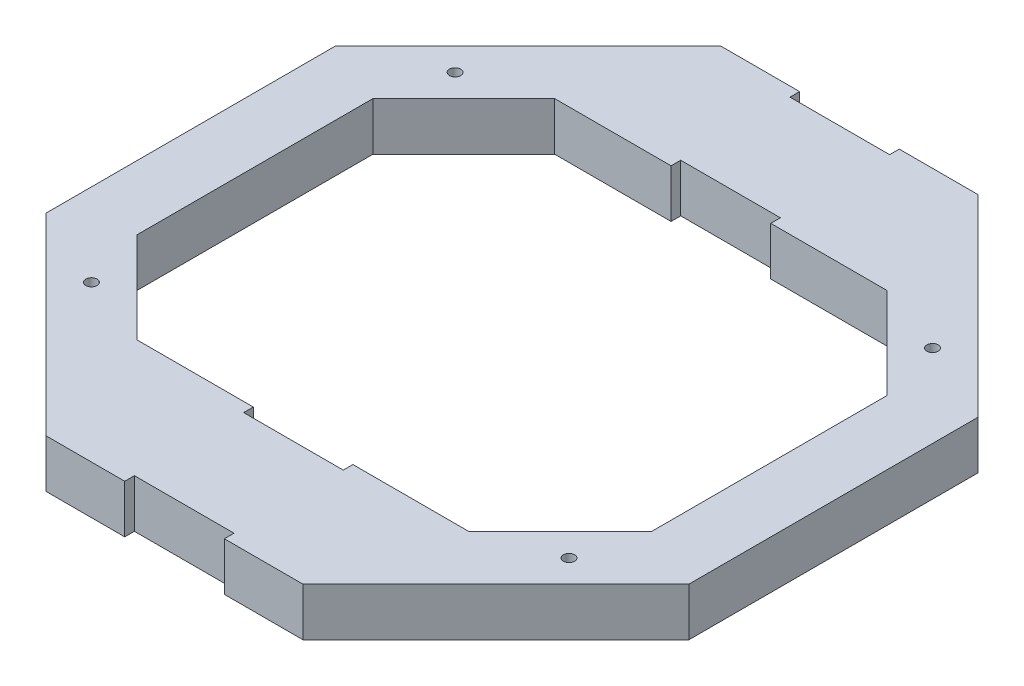
ISO-10303-21;
HEADER;
FILE_DESCRIPTION(('STEP AP214'),'2;1');
FILE_NAME('part.step','',(''),(''),'','','');
FILE_SCHEMA(('AUTOMOTIVE_DESIGN { 1 0 10303 214 1 1 1 1 }'));
ENDSEC;
DATA;
#1=APPLICATION_CONTEXT('core data for automotive mechanical design processes');
#2=APPLICATION_PROTOCOL_DEFINITION('international standard','automotive_design',2000,#1);
#3=PRODUCT_CONTEXT('',#1,'mechanical');
#4=PRODUCT('Part','Part','',(#3));
#5=PRODUCT_RELATED_PRODUCT_CATEGORY('part','',(#4));
#6=PRODUCT_DEFINITION_FORMATION('','',#4);
#7=PRODUCT_DEFINITION_CONTEXT('part definition',#1,'design');
#8=PRODUCT_DEFINITION('design','',#6,#7);
#9=PRODUCT_DEFINITION_SHAPE('','',#8);
#10=(LENGTH_UNIT() NAMED_UNIT(*) SI_UNIT(.MILLI.,.METRE.));
#11=(NAMED_UNIT(*) PLANE_ANGLE_UNIT() SI_UNIT($,.RADIAN.));
#12=(NAMED_UNIT(*) SI_UNIT($,.STERADIAN.) SOLID_ANGLE_UNIT());
#13=UNCERTAINTY_MEASURE_WITH_UNIT(LENGTH_MEASURE(1.E-05),#10,'distance_accuracy_value','');
#14=(GEOMETRIC_REPRESENTATION_CONTEXT(3) GLOBAL_UNCERTAINTY_ASSIGNED_CONTEXT((#13)) GLOBAL_UNIT_ASSIGNED_CONTEXT((#10,
#11,#12)) REPRESENTATION_CONTEXT('',''));
#15=CARTESIAN_POINT('',(0.,0.,0.));
#16=DIRECTION('',(0.,0.,1.));
#17=DIRECTION('',(1.,0.,0.));
#18=AXIS2_PLACEMENT_3D('',#15,#16,#17);
#19=CARTESIAN_POINT('',(-40.0000000000001,15.,105.));
#20=DIRECTION('',(0.,0.,-1.));
#21=DIRECTION('',(-1.,0.,0.));
#22=AXIS2_PLACEMENT_3D('',#19,#20,#21);
#23=PLANE('',#22);
#24=DIRECTION('',(1.,0.,0.));
#25=VECTOR('',#24,1.);
#26=CARTESIAN_POINT('',(-40.0000000000001,0.,105.));
#27=LINE('',#26,#25);
#28=CARTESIAN_POINT('',(-40.0000000000001,0.,105.));
#29=VERTEX_POINT('',#28);
#30=CARTESIAN_POINT('',(-15.5,0.,105.));
#31=VERTEX_POINT('',#30);
#32=EDGE_CURVE('E263',#29,#31,#27,.T.);
#33=ORIENTED_EDGE('',*,*,#32,.T.);
#34=DIRECTION('',(0.,1.,0.));
#35=VECTOR('',#34,1.);
#36=CARTESIAN_POINT('',(-15.5,0.,105.));
#37=LINE('',#36,#35);
#38=CARTESIAN_POINT('',(-15.5,15.,105.));
#39=VERTEX_POINT('',#38);
#40=EDGE_CURVE('E244',#31,#39,#37,.T.);
#41=ORIENTED_EDGE('',*,*,#40,.T.);
#42=DIRECTION('',(1.,0.,0.));
#43=VECTOR('',#42,1.);
#44=CARTESIAN_POINT('',(-40.0000000000001,15.,105.));
#45=LINE('',#44,#43);
#46=CARTESIAN_POINT('',(-40.0000000000001,15.,105.));
#47=VERTEX_POINT('',#46);
#48=EDGE_CURVE('E361',#47,#39,#45,.T.);
#49=ORIENTED_EDGE('',*,*,#48,.F.);
#50=DIRECTION('',(0.,-1.,0.));
#51=VECTOR('',#50,1.);
#52=CARTESIAN_POINT('',(-40.0000000000001,15.,105.));
#53=LINE('',#52,#51);
#54=EDGE_CURVE('E43',#47,#29,#53,.T.);
#55=ORIENTED_EDGE('',*,*,#54,.T.);
#56=EDGE_LOOP('',(#33,#41,#49,#55));
#57=FACE_BOUND('',#56,.T.);
#58=ADVANCED_FACE('F35',(#57),#23,.F.);
#59=CARTESIAN_POINT('',(-40.,15.,-105.));
#60=DIRECTION('',(0.,0.,1.));
#61=DIRECTION('',(1.,0.,0.));
#62=AXIS2_PLACEMENT_3D('',#59,#60,#61);
#63=PLANE('',#62);
#64=DIRECTION('',(-1.,0.,0.));
#65=VECTOR('',#64,1.);
#66=CARTESIAN_POINT('',(-40.,0.,-105.));
#67=LINE('',#66,#65);
#68=CARTESIAN_POINT('',(40.,0.,-105.));
#69=VERTEX_POINT('',#68);
#70=CARTESIAN_POINT('',(15.5,0.,-105.));
#71=VERTEX_POINT('',#70);
#72=EDGE_CURVE('E282',#69,#71,#67,.T.);
#73=ORIENTED_EDGE('',*,*,#72,.T.);
#74=DIRECTION('',(0.,1.,0.));
#75=VECTOR('',#74,1.);
#76=CARTESIAN_POINT('',(15.5,0.,-105.));
#77=LINE('',#76,#75);
#78=CARTESIAN_POINT('',(15.5,15.,-105.));
#79=VERTEX_POINT('',#78);
#80=EDGE_CURVE('E387',#71,#79,#77,.T.);
#81=ORIENTED_EDGE('',*,*,#80,.T.);
#82=DIRECTION('',(-1.,0.,0.));
#83=VECTOR('',#82,1.);
#84=CARTESIAN_POINT('',(-40.,15.,-105.));
#85=LINE('',#84,#83);
#86=CARTESIAN_POINT('',(40.,15.,-105.));
#87=VERTEX_POINT('',#86);
#88=EDGE_CURVE('E334',#87,#79,#85,.T.);
#89=ORIENTED_EDGE('',*,*,#88,.F.);
#90=DIRECTION('',(0.,-1.,0.));
#91=VECTOR('',#90,1.);
#92=CARTESIAN_POINT('',(40.,15.,-105.));
#93=LINE('',#92,#91);
#94=EDGE_CURVE('E295',#87,#69,#93,.T.);
#95=ORIENTED_EDGE('',*,*,#94,.T.);
#96=EDGE_LOOP('',(#73,#81,#89,#95));
#97=FACE_BOUND('',#96,.T.);
#98=ADVANCED_FACE('F605',(#97),#63,.F.);
#99=CARTESIAN_POINT('',(-51.7157287525382,15.,65.));
#100=DIRECTION('',(0.,0.,-1.));
#101=DIRECTION('',(-1.,0.,0.));
#102=AXIS2_PLACEMENT_3D('',#99,#100,#101);
#103=PLANE('',#102);
#104=DIRECTION('',(0.,1.,0.));
#105=VECTOR('',#104,1.);
#106=CARTESIAN_POINT('',(15.5,0.,65.));
#107=LINE('',#106,#105);
#108=CARTESIAN_POINT('',(15.5,0.,65.));
#109=VERTEX_POINT('',#108);
#110=CARTESIAN_POINT('',(15.5,15.,65.));
#111=VERTEX_POINT('',#110);
#112=EDGE_CURVE('E380',#109,#111,#107,.T.);
#113=ORIENTED_EDGE('',*,*,#112,.T.);
#114=DIRECTION('',(1.,0.,0.));
#115=VECTOR('',#114,1.);
#116=CARTESIAN_POINT('',(-51.7157287525382,15.,65.));
#117=LINE('',#116,#115);
#118=CARTESIAN_POINT('',(51.7157287525383,15.,65.));
#119=VERTEX_POINT('',#118);
#120=EDGE_CURVE('E473',#111,#119,#117,.T.);
#121=ORIENTED_EDGE('',*,*,#120,.T.);
#122=DIRECTION('',(0.,-1.,0.));
#123=VECTOR('',#122,1.);
#124=CARTESIAN_POINT('',(51.7157287525383,15.,65.));
#125=LINE('',#124,#123);
#126=CARTESIAN_POINT('',(51.7157287525383,0.,65.));
#127=VERTEX_POINT('',#126);
#128=EDGE_CURVE('E346',#119,#127,#125,.T.);
#129=ORIENTED_EDGE('',*,*,#128,.T.);
#130=DIRECTION('',(1.,0.,0.));
#131=VECTOR('',#130,1.);
#132=CARTESIAN_POINT('',(-51.7157287525382,0.,65.));
#133=LINE('',#132,#131);
#134=EDGE_CURVE('E495',#109,#127,#133,.T.);
#135=ORIENTED_EDGE('',*,*,#134,.F.);
#136=EDGE_LOOP('',(#113,#121,#129,#135));
#137=FACE_BOUND('',#136,.T.);
#138=ADVANCED_FACE('F542',(#137),#103,.T.);
#139=CARTESIAN_POINT('',(-51.7157287525382,15.,-65.));
#140=DIRECTION('',(0.,0.,1.));
#141=DIRECTION('',(1.,0.,0.));
#142=AXIS2_PLACEMENT_3D('',#139,#140,#141);
#143=PLANE('',#142);
#144=DIRECTION('',(0.,1.,0.));
#145=VECTOR('',#144,1.);
#146=CARTESIAN_POINT('',(-15.5,0.,-65.));
#147=LINE('',#146,#145);
#148=CARTESIAN_POINT('',(-15.5,0.,-65.));
#149=VERTEX_POINT('',#148);
#150=CARTESIAN_POINT('',(-15.5,15.,-65.));
#151=VERTEX_POINT('',#150);
#152=EDGE_CURVE('E425',#149,#151,#147,.T.);
#153=ORIENTED_EDGE('',*,*,#152,.T.);
#154=DIRECTION('',(-1.,0.,0.));
#155=VECTOR('',#154,1.);
#156=CARTESIAN_POINT('',(-51.7157287525382,15.,-65.));
#157=LINE('',#156,#155);
#158=CARTESIAN_POINT('',(-51.7157287525382,15.,-65.));
#159=VERTEX_POINT('',#158);
#160=EDGE_CURVE('E484',#151,#159,#157,.T.);
#161=ORIENTED_EDGE('',*,*,#160,.T.);
#162=DIRECTION('',(0.,-1.,0.));
#163=VECTOR('',#162,1.);
#164=CARTESIAN_POINT('',(-51.7157287525382,15.,-65.));
#165=LINE('',#164,#163);
#166=CARTESIAN_POINT('',(-51.7157287525382,0.,-65.));
#167=VERTEX_POINT('',#166);
#168=EDGE_CURVE('E521',#159,#167,#165,.T.);
#169=ORIENTED_EDGE('',*,*,#168,.T.);
#170=DIRECTION('',(-1.,0.,0.));
#171=VECTOR('',#170,1.);
#172=CARTESIAN_POINT('',(-51.7157287525382,0.,-65.));
#173=LINE('',#172,#171);
#174=EDGE_CURVE('E508',#149,#167,#173,.T.);
#175=ORIENTED_EDGE('',*,*,#174,.F.);
#176=EDGE_LOOP('',(#153,#161,#169,#175));
#177=FACE_BOUND('',#176,.T.);
#178=ADVANCED_FACE('F569',(#177),#143,.T.);
#179=CARTESIAN_POINT('',(0.,15.,0.));
#180=DIRECTION('',(0.,1.,0.));
#181=DIRECTION('',(0.,0.,1.));
#182=AXIS2_PLACEMENT_3D('',#179,#180,#181);
#183=PLANE('',#182);
#184=CARTESIAN_POINT('',(-74.2893218813453,15.,56.5685424949239));
#185=DIRECTION('',(0.,1.,0.));
#186=DIRECTION('',(0.,0.,1.));
#187=AXIS2_PLACEMENT_3D('',#184,#185,#186);
#188=CIRCLE('',#187,1.75000000000001);
#189=CARTESIAN_POINT('',(-74.2893218813453,15.,58.3185424949239));
#190=VERTEX_POINT('',#189);
#191=EDGE_CURVE('E467',#190,#190,#188,.T.);
#192=ORIENTED_EDGE('',*,*,#191,.F.);
#193=EDGE_LOOP('',(#192));
#194=FACE_BOUND('',#193,.T.);
#195=DIRECTION('',(0.,0.,1.));
#196=VECTOR('',#195,1.);
#197=CARTESIAN_POINT('',(-15.4999999999996,15.,0.));
#198=LINE('',#197,#196);
#199=CARTESIAN_POINT('',(-15.4999999999999,15.,102.));
#200=VERTEX_POINT('',#199);
#201=EDGE_CURVE('E251',#200,#39,#198,.T.);
#202=ORIENTED_EDGE('',*,*,#201,.F.);
#203=DIRECTION('',(-1.,0.,0.));
#204=VECTOR('',#203,1.);
#205=CARTESIAN_POINT('',(0.,15.,102.));
#206=LINE('',#205,#204);
#207=CARTESIAN_POINT('',(15.5,15.,102.));
#208=VERTEX_POINT('',#207);
#209=EDGE_CURVE('E465',#208,#200,#206,.T.);
#210=ORIENTED_EDGE('',*,*,#209,.F.);
#211=DIRECTION('',(0.,0.,-1.));
#212=VECTOR('',#211,1.);
#213=CARTESIAN_POINT('',(15.4999999999996,15.,0.));
#214=LINE('',#213,#212);
#215=CARTESIAN_POINT('',(15.5,15.,105.));
#216=VERTEX_POINT('',#215);
#217=EDGE_CURVE('E366',#216,#208,#214,.T.);
#218=ORIENTED_EDGE('',*,*,#217,.F.);
#219=CARTESIAN_POINT('',(40.,15.,105.));
#220=VERTEX_POINT('',#219);
#221=EDGE_CURVE('E360',#216,#220,#45,.T.);
#222=ORIENTED_EDGE('',*,*,#221,.T.);
#223=DIRECTION('',(0.707106781186548,0.,-0.707106781186547));
#224=VECTOR('',#223,1.);
#225=CARTESIAN_POINT('',(100.,15.,45.));
#226=LINE('',#225,#224);
#227=CARTESIAN_POINT('',(100.,15.,45.));
#228=VERTEX_POINT('',#227);
#229=EDGE_CURVE('E312',#220,#228,#226,.T.);
#230=ORIENTED_EDGE('',*,*,#229,.T.);
#231=DIRECTION('',(0.,0.,-1.));
#232=VECTOR('',#231,1.);
#233=CARTESIAN_POINT('',(100.,15.,-45.));
#234=LINE('',#233,#232);
#235=CARTESIAN_POINT('',(100.,15.,-45.));
#236=VERTEX_POINT('',#235);
#237=EDGE_CURVE('E332',#228,#236,#234,.T.);
#238=ORIENTED_EDGE('',*,*,#237,.T.);
#239=DIRECTION('',(-0.707106781186548,0.,-0.707106781186547));
#240=VECTOR('',#239,1.);
#241=CARTESIAN_POINT('',(40.,15.,-105.));
#242=LINE('',#241,#240);
#243=EDGE_CURVE('E327',#236,#87,#242,.T.);
#244=ORIENTED_EDGE('',*,*,#243,.T.);
#245=ORIENTED_EDGE('',*,*,#88,.T.);
#246=DIRECTION('',(0.,0.,-1.));
#247=VECTOR('',#246,1.);
#248=CARTESIAN_POINT('',(15.4999999999996,15.,0.));
#249=LINE('',#248,#247);
#250=CARTESIAN_POINT('',(15.5,15.,-102.));
#251=VERTEX_POINT('',#250);
#252=EDGE_CURVE('E446',#251,#79,#249,.T.);
#253=ORIENTED_EDGE('',*,*,#252,.F.);
#254=DIRECTION('',(1.,0.,0.));
#255=VECTOR('',#254,1.);
#256=CARTESIAN_POINT('',(0.,15.,-102.));
#257=LINE('',#256,#255);
#258=CARTESIAN_POINT('',(-15.5,15.,-102.));
#259=VERTEX_POINT('',#258);
#260=EDGE_CURVE('E461',#259,#251,#257,.T.);
#261=ORIENTED_EDGE('',*,*,#260,.F.);
#262=DIRECTION('',(0.,0.,1.));
#263=VECTOR('',#262,1.);
#264=CARTESIAN_POINT('',(-15.4999999999996,15.,0.));
#265=LINE('',#264,#263);
#266=CARTESIAN_POINT('',(-15.5,15.,-105.));
#267=VERTEX_POINT('',#266);
#268=EDGE_CURVE('E444',#267,#259,#265,.T.);
#269=ORIENTED_EDGE('',*,*,#268,.F.);
#270=CARTESIAN_POINT('',(-40.,15.,-105.));
#271=VERTEX_POINT('',#270);
#272=EDGE_CURVE('E331',#267,#271,#85,.T.);
#273=ORIENTED_EDGE('',*,*,#272,.T.);
#274=DIRECTION('',(-0.707106781186549,0.,0.707106781186547));
#275=VECTOR('',#274,1.);
#276=CARTESIAN_POINT('',(-40.,15.,-105.));
#277=LINE('',#276,#275);
#278=CARTESIAN_POINT('',(-100.,15.,-45.));
#279=VERTEX_POINT('',#278);
#280=EDGE_CURVE('E292',#271,#279,#277,.T.);
#281=ORIENTED_EDGE('',*,*,#280,.T.);
#282=DIRECTION('',(0.,0.,1.));
#283=VECTOR('',#282,1.);
#284=CARTESIAN_POINT('',(-100.,15.,-45.));
#285=LINE('',#284,#283);
#286=CARTESIAN_POINT('',(-100.,15.,45.));
#287=VERTEX_POINT('',#286);
#288=EDGE_CURVE('E287',#279,#287,#285,.T.);
#289=ORIENTED_EDGE('',*,*,#288,.T.);
#290=DIRECTION('',(0.707106781186548,0.,0.707106781186547));
#291=VECTOR('',#290,1.);
#292=CARTESIAN_POINT('',(-100.,15.,45.));
#293=LINE('',#292,#291);
#294=EDGE_CURVE('E358',#287,#47,#293,.T.);
#295=ORIENTED_EDGE('',*,*,#294,.T.);
#296=ORIENTED_EDGE('',*,*,#48,.T.);
#297=EDGE_LOOP('',(#202,#210,#218,#222,#230,#238,#244,#245,#253,#261,#269,#273,#281,#289,#295,#296));
#298=FACE_BOUND('',#297,.T.);
#299=DIRECTION('',(0.,0.,-1.));
#300=VECTOR('',#299,1.);
#301=CARTESIAN_POINT('',(15.4999999999993,15.,-1.61329283265836E-13));
#302=LINE('',#301,#300);
#303=CARTESIAN_POINT('',(15.5,15.,68.));
#304=VERTEX_POINT('',#303);
#305=EDGE_CURVE('E442',#304,#111,#302,.T.);
#306=ORIENTED_EDGE('',*,*,#305,.F.);
#307=DIRECTION('',(1.,0.,0.));
#308=VECTOR('',#307,1.);
#309=CARTESIAN_POINT('',(0.,15.,68.));
#310=LINE('',#309,#308);
#311=CARTESIAN_POINT('',(-15.5,15.,68.));
#312=VERTEX_POINT('',#311);
#313=EDGE_CURVE('E463',#312,#304,#310,.T.);
#314=ORIENTED_EDGE('',*,*,#313,.F.);
#315=DIRECTION('',(0.,0.,1.));
#316=VECTOR('',#315,1.);
#317=CARTESIAN_POINT('',(-15.4999999999993,15.,-1.61329283265835E-13));
#318=LINE('',#317,#316);
#319=CARTESIAN_POINT('',(-15.5,15.,65.));
#320=VERTEX_POINT('',#319);
#321=EDGE_CURVE('E440',#320,#312,#318,.T.);
#322=ORIENTED_EDGE('',*,*,#321,.F.);
#323=CARTESIAN_POINT('',(-51.7157287525382,15.,65.));
#324=VERTEX_POINT('',#323);
#325=EDGE_CURVE('E475',#324,#320,#117,.T.);
#326=ORIENTED_EDGE('',*,*,#325,.F.);
#327=DIRECTION('',(0.707106781186547,0.,0.707106781186548));
#328=VECTOR('',#327,1.);
#329=CARTESIAN_POINT('',(-80.0000000000001,15.,36.7157287525381));
#330=LINE('',#329,#328);
#331=CARTESIAN_POINT('',(-80.0000000000001,15.,36.7157287525381));
#332=VERTEX_POINT('',#331);
#333=EDGE_CURVE('E471',#332,#324,#330,.T.);
#334=ORIENTED_EDGE('',*,*,#333,.F.);
#335=DIRECTION('',(0.,0.,1.));
#336=VECTOR('',#335,1.);
#337=CARTESIAN_POINT('',(-80.0000000000001,15.,36.7157287525381));
#338=LINE('',#337,#336);
#339=CARTESIAN_POINT('',(-80.0000000000001,15.,-36.7157287525381));
#340=VERTEX_POINT('',#339);
#341=EDGE_CURVE('E491',#340,#332,#338,.T.);
#342=ORIENTED_EDGE('',*,*,#341,.F.);
#343=DIRECTION('',(-0.707106781186547,0.,0.707106781186548));
#344=VECTOR('',#343,1.);
#345=CARTESIAN_POINT('',(-80.0000000000001,15.,-36.7157287525381));
#346=LINE('',#345,#344);
#347=EDGE_CURVE('E488',#159,#340,#346,.T.);
#348=ORIENTED_EDGE('',*,*,#347,.F.);
#349=ORIENTED_EDGE('',*,*,#160,.F.);
#350=DIRECTION('',(0.,0.,1.));
#351=VECTOR('',#350,1.);
#352=CARTESIAN_POINT('',(-15.5,15.,0.));
#353=LINE('',#352,#351);
#354=CARTESIAN_POINT('',(-15.5,15.,-68.));
#355=VERTEX_POINT('',#354);
#356=EDGE_CURVE('E438',#355,#151,#353,.T.);
#357=ORIENTED_EDGE('',*,*,#356,.F.);
#358=DIRECTION('',(-1.,0.,0.));
#359=VECTOR('',#358,1.);
#360=CARTESIAN_POINT('',(0.,15.,-68.));
#361=LINE('',#360,#359);
#362=CARTESIAN_POINT('',(15.5,15.,-68.));
#363=VERTEX_POINT('',#362);
#364=EDGE_CURVE('E450',#363,#355,#361,.T.);
#365=ORIENTED_EDGE('',*,*,#364,.F.);
#366=DIRECTION('',(0.,0.,-1.));
#367=VECTOR('',#366,1.);
#368=CARTESIAN_POINT('',(15.5,15.,0.));
#369=LINE('',#368,#367);
#370=CARTESIAN_POINT('',(15.5,15.,-65.));
#371=VERTEX_POINT('',#370);
#372=EDGE_CURVE('E429',#371,#363,#369,.T.);
#373=ORIENTED_EDGE('',*,*,#372,.F.);
#374=CARTESIAN_POINT('',(51.7157287525383,15.,-65.));
#375=VERTEX_POINT('',#374);
#376=EDGE_CURVE('E485',#375,#371,#157,.T.);
#377=ORIENTED_EDGE('',*,*,#376,.F.);
#378=DIRECTION('',(-0.707106781186547,0.,-0.707106781186548));
#379=VECTOR('',#378,1.);
#380=CARTESIAN_POINT('',(80.0000000000001,15.,-36.7157287525381));
#381=LINE('',#380,#379);
#382=CARTESIAN_POINT('',(80.0000000000001,15.,-36.7157287525381));
#383=VERTEX_POINT('',#382);
#384=EDGE_CURVE('E482',#383,#375,#381,.T.);
#385=ORIENTED_EDGE('',*,*,#384,.F.);
#386=DIRECTION('',(0.,0.,-1.));
#387=VECTOR('',#386,1.);
#388=CARTESIAN_POINT('',(80.0000000000002,15.,36.7157287525381));
#389=LINE('',#388,#387);
#390=CARTESIAN_POINT('',(80.0000000000002,15.,36.7157287525381));
#391=VERTEX_POINT('',#390);
#392=EDGE_CURVE('E480',#391,#383,#389,.T.);
#393=ORIENTED_EDGE('',*,*,#392,.F.);
#394=DIRECTION('',(0.707106781186547,0.,-0.707106781186548));
#395=VECTOR('',#394,1.);
#396=CARTESIAN_POINT('',(80.0000000000002,15.,36.7157287525381));
#397=LINE('',#396,#395);
#398=EDGE_CURVE('E478',#119,#391,#397,.T.);
#399=ORIENTED_EDGE('',*,*,#398,.F.);
#400=ORIENTED_EDGE('',*,*,#120,.F.);
#401=EDGE_LOOP('',(#306,#314,#322,#326,#334,#342,#348,#349,#357,#365,#373,#377,#385,#393,#399,#400));
#402=FACE_BOUND('',#401,.T.);
#403=CARTESIAN_POINT('',(74.2893218813465,15.,-56.5685424949224));
#404=DIRECTION('',(0.,1.,0.));
#405=DIRECTION('',(0.,0.,1.));
#406=AXIS2_PLACEMENT_3D('',#403,#404,#405);
#407=CIRCLE('',#406,1.74999999999999);
#408=CARTESIAN_POINT('',(74.2893218813465,15.,-54.8185424949224));
#409=VERTEX_POINT('',#408);
#410=EDGE_CURVE('E458',#409,#409,#407,.T.);
#411=ORIENTED_EDGE('',*,*,#410,.F.);
#412=EDGE_LOOP('',(#411));
#413=FACE_BOUND('',#412,.T.);
#414=CARTESIAN_POINT('',(-74.2893218813453,15.,-56.5685424949239));
#415=DIRECTION('',(0.,1.,0.));
#416=DIRECTION('',(0.,0.,1.));
#417=AXIS2_PLACEMENT_3D('',#414,#415,#416);
#418=CIRCLE('',#417,1.75000000000001);
#419=CARTESIAN_POINT('',(-74.2893218813453,15.,-54.8185424949239));
#420=VERTEX_POINT('',#419);
#421=EDGE_CURVE('E455',#420,#420,#418,.T.);
#422=ORIENTED_EDGE('',*,*,#421,.F.);
#423=EDGE_LOOP('',(#422));
#424=FACE_BOUND('',#423,.T.);
#425=CARTESIAN_POINT('',(74.2893218813441,15.,56.5685424949255));
#426=DIRECTION('',(0.,1.,0.));
#427=DIRECTION('',(0.,0.,1.));
#428=AXIS2_PLACEMENT_3D('',#425,#426,#427);
#429=CIRCLE('',#428,1.75000000000002);
#430=CARTESIAN_POINT('',(74.2893218813441,15.,58.3185424949255));
#431=VERTEX_POINT('',#430);
#432=EDGE_CURVE('E452',#431,#431,#429,.T.);
#433=ORIENTED_EDGE('',*,*,#432,.F.);
#434=EDGE_LOOP('',(#433));
#435=FACE_BOUND('',#434,.T.);
#436=ADVANCED_FACE('F362',(#194,#298,#402,#413,#424,#435),#183,.T.);
#437=CARTESIAN_POINT('',(0.,0.,0.));
#438=DIRECTION('',(0.,1.,0.));
#439=DIRECTION('',(0.,0.,1.));
#440=AXIS2_PLACEMENT_3D('',#437,#438,#439);
#441=PLANE('',#440);
#442=CARTESIAN_POINT('',(-74.2893218813453,0.,56.5685424949239));
#443=DIRECTION('',(0.,1.,0.));
#444=DIRECTION('',(0.,0.,1.));
#445=AXIS2_PLACEMENT_3D('',#442,#443,#444);
#446=CIRCLE('',#445,1.75000000000001);
#447=CARTESIAN_POINT('',(-74.2893218813453,0.,58.3185424949239));
#448=VERTEX_POINT('',#447);
#449=EDGE_CURVE('E265',#448,#448,#446,.T.);
#450=ORIENTED_EDGE('',*,*,#449,.T.);
#451=EDGE_LOOP('',(#450));
#452=FACE_BOUND('',#451,.T.);
#453=CARTESIAN_POINT('',(74.2893218813465,0.,-56.5685424949224));
#454=DIRECTION('',(0.,1.,0.));
#455=DIRECTION('',(0.,0.,1.));
#456=AXIS2_PLACEMENT_3D('',#453,#454,#455);
#457=CIRCLE('',#456,1.74999999999999);
#458=CARTESIAN_POINT('',(74.2893218813465,0.,-54.8185424949224));
#459=VERTEX_POINT('',#458);
#460=EDGE_CURVE('E377',#459,#459,#457,.T.);
#461=ORIENTED_EDGE('',*,*,#460,.T.);
#462=EDGE_LOOP('',(#461));
#463=FACE_BOUND('',#462,.T.);
#464=CARTESIAN_POINT('',(-74.2893218813453,0.,-56.5685424949239));
#465=DIRECTION('',(0.,1.,0.));
#466=DIRECTION('',(0.,0.,-1.));
#467=AXIS2_PLACEMENT_3D('',#464,#465,#466);
#468=CIRCLE('',#467,1.75000000000001);
#469=CARTESIAN_POINT('',(-74.2893218813453,0.,-58.3185424949239));
#470=VERTEX_POINT('',#469);
#471=EDGE_CURVE('E689',#470,#470,#468,.T.);
#472=ORIENTED_EDGE('',*,*,#471,.T.);
#473=EDGE_LOOP('',(#472));
#474=FACE_BOUND('',#473,.T.);
#475=CARTESIAN_POINT('',(74.2893218813441,0.,56.5685424949255));
#476=DIRECTION('',(0.,1.,0.));
#477=DIRECTION('',(0.,0.,-1.));
#478=AXIS2_PLACEMENT_3D('',#475,#476,#477);
#479=CIRCLE('',#478,1.75000000000002);
#480=CARTESIAN_POINT('',(74.2893218813441,0.,54.8185424949255));
#481=VERTEX_POINT('',#480);
#482=EDGE_CURVE('E692',#481,#481,#479,.T.);
#483=ORIENTED_EDGE('',*,*,#482,.T.);
#484=EDGE_LOOP('',(#483));
#485=FACE_BOUND('',#484,.T.);
#486=DIRECTION('',(-1.,0.,0.));
#487=VECTOR('',#486,1.);
#488=CARTESIAN_POINT('',(-15.4999999999999,0.,102.));
#489=LINE('',#488,#487);
#490=CARTESIAN_POINT('',(15.5,0.,102.));
#491=VERTEX_POINT('',#490);
#492=CARTESIAN_POINT('',(-15.4999999999999,0.,102.));
#493=VERTEX_POINT('',#492);
#494=EDGE_CURVE('E257',#491,#493,#489,.T.);
#495=ORIENTED_EDGE('',*,*,#494,.T.);
#496=DIRECTION('',(0.,0.,1.));
#497=VECTOR('',#496,1.);
#498=CARTESIAN_POINT('',(-15.5,0.,105.));
#499=LINE('',#498,#497);
#500=EDGE_CURVE('E248',#493,#31,#499,.T.);
#501=ORIENTED_EDGE('',*,*,#500,.T.);
#502=ORIENTED_EDGE('',*,*,#32,.F.);
#503=DIRECTION('',(0.707106781186548,0.,0.707106781186547));
#504=VECTOR('',#503,1.);
#505=CARTESIAN_POINT('',(-100.,0.,45.));
#506=LINE('',#505,#504);
#507=CARTESIAN_POINT('',(-100.,0.,45.));
#508=VERTEX_POINT('',#507);
#509=EDGE_CURVE('E274',#508,#29,#506,.T.);
#510=ORIENTED_EDGE('',*,*,#509,.F.);
#511=DIRECTION('',(0.,0.,1.));
#512=VECTOR('',#511,1.);
#513=CARTESIAN_POINT('',(-100.,0.,-45.));
#514=LINE('',#513,#512);
#515=CARTESIAN_POINT('',(-100.,0.,-45.));
#516=VERTEX_POINT('',#515);
#517=EDGE_CURVE('E339',#516,#508,#514,.T.);
#518=ORIENTED_EDGE('',*,*,#517,.F.);
#519=DIRECTION('',(-0.707106781186549,0.,0.707106781186547));
#520=VECTOR('',#519,1.);
#521=CARTESIAN_POINT('',(-40.,0.,-105.));
#522=LINE('',#521,#520);
#523=CARTESIAN_POINT('',(-40.,0.,-105.));
#524=VERTEX_POINT('',#523);
#525=EDGE_CURVE('E285',#524,#516,#522,.T.);
#526=ORIENTED_EDGE('',*,*,#525,.F.);
#527=CARTESIAN_POINT('',(-15.5,0.,-105.));
#528=VERTEX_POINT('',#527);
#529=EDGE_CURVE('E281',#528,#524,#67,.T.);
#530=ORIENTED_EDGE('',*,*,#529,.F.);
#531=DIRECTION('',(0.,0.,1.));
#532=VECTOR('',#531,1.);
#533=CARTESIAN_POINT('',(-15.5,0.,-105.));
#534=LINE('',#533,#532);
#535=CARTESIAN_POINT('',(-15.5,0.,-102.));
#536=VERTEX_POINT('',#535);
#537=EDGE_CURVE('E58',#528,#536,#534,.T.);
#538=ORIENTED_EDGE('',*,*,#537,.T.);
#539=DIRECTION('',(1.,0.,0.));
#540=VECTOR('',#539,1.);
#541=CARTESIAN_POINT('',(-15.5,0.,-102.));
#542=LINE('',#541,#540);
#543=CARTESIAN_POINT('',(15.5,0.,-102.));
#544=VERTEX_POINT('',#543);
#545=EDGE_CURVE('E379',#536,#544,#542,.T.);
#546=ORIENTED_EDGE('',*,*,#545,.T.);
#547=DIRECTION('',(0.,0.,-1.));
#548=VECTOR('',#547,1.);
#549=CARTESIAN_POINT('',(15.5,0.,-105.));
#550=LINE('',#549,#548);
#551=EDGE_CURVE('E383',#544,#71,#550,.T.);
#552=ORIENTED_EDGE('',*,*,#551,.T.);
#553=ORIENTED_EDGE('',*,*,#72,.F.);
#554=DIRECTION('',(-0.707106781186548,0.,-0.707106781186547));
#555=VECTOR('',#554,1.);
#556=CARTESIAN_POINT('',(40.,0.,-105.));
#557=LINE('',#556,#555);
#558=CARTESIAN_POINT('',(100.,0.,-45.));
#559=VERTEX_POINT('',#558);
#560=EDGE_CURVE('E279',#559,#69,#557,.T.);
#561=ORIENTED_EDGE('',*,*,#560,.F.);
#562=DIRECTION('',(0.,0.,-1.));
#563=VECTOR('',#562,1.);
#564=CARTESIAN_POINT('',(100.,0.,-45.));
#565=LINE('',#564,#563);
#566=CARTESIAN_POINT('',(100.,0.,45.));
#567=VERTEX_POINT('',#566);
#568=EDGE_CURVE('E272',#567,#559,#565,.T.);
#569=ORIENTED_EDGE('',*,*,#568,.F.);
#570=DIRECTION('',(0.707106781186548,0.,-0.707106781186547));
#571=VECTOR('',#570,1.);
#572=CARTESIAN_POINT('',(100.,0.,45.));
#573=LINE('',#572,#571);
#574=CARTESIAN_POINT('',(40.,0.,105.));
#575=VERTEX_POINT('',#574);
#576=EDGE_CURVE('E269',#575,#567,#573,.T.);
#577=ORIENTED_EDGE('',*,*,#576,.F.);
#578=CARTESIAN_POINT('',(15.5,0.,105.));
#579=VERTEX_POINT('',#578);
#580=EDGE_CURVE('E270',#579,#575,#27,.T.);
#581=ORIENTED_EDGE('',*,*,#580,.F.);
#582=DIRECTION('',(0.,0.,-1.));
#583=VECTOR('',#582,1.);
#584=CARTESIAN_POINT('',(15.5,0.,105.));
#585=LINE('',#584,#583);
#586=EDGE_CURVE('E50',#579,#491,#585,.T.);
#587=ORIENTED_EDGE('',*,*,#586,.T.);
#588=EDGE_LOOP('',(#495,#501,#502,#510,#518,#526,#530,#538,#546,#552,#553,#561,#569,#577,#581,#587));
#589=FACE_BOUND('',#588,.T.);
#590=DIRECTION('',(1.,0.,0.));
#591=VECTOR('',#590,1.);
#592=CARTESIAN_POINT('',(-15.5,0.,68.));
#593=LINE('',#592,#591);
#594=CARTESIAN_POINT('',(-15.5,0.,68.));
#595=VERTEX_POINT('',#594);
#596=CARTESIAN_POINT('',(15.5,0.,68.));
#597=VERTEX_POINT('',#596);
#598=EDGE_CURVE('E401',#595,#597,#593,.T.);
#599=ORIENTED_EDGE('',*,*,#598,.T.);
#600=DIRECTION('',(0.,0.,-1.));
#601=VECTOR('',#600,1.);
#602=CARTESIAN_POINT('',(15.5,0.,65.));
#603=LINE('',#602,#601);
#604=EDGE_CURVE('E404',#597,#109,#603,.T.);
#605=ORIENTED_EDGE('',*,*,#604,.T.);
#606=ORIENTED_EDGE('',*,*,#134,.T.);
#607=DIRECTION('',(0.707106781186547,0.,-0.707106781186548));
#608=VECTOR('',#607,1.);
#609=CARTESIAN_POINT('',(80.0000000000002,0.,36.7157287525381));
#610=LINE('',#609,#608);
#611=CARTESIAN_POINT('',(80.0000000000002,0.,36.7157287525381));
#612=VERTEX_POINT('',#611);
#613=EDGE_CURVE('E499',#127,#612,#610,.T.);
#614=ORIENTED_EDGE('',*,*,#613,.T.);
#615=DIRECTION('',(0.,0.,-1.));
#616=VECTOR('',#615,1.);
#617=CARTESIAN_POINT('',(80.0000000000002,0.,36.7157287525381));
#618=LINE('',#617,#616);
#619=CARTESIAN_POINT('',(80.0000000000001,0.,-36.7157287525381));
#620=VERTEX_POINT('',#619);
#621=EDGE_CURVE('E502',#612,#620,#618,.T.);
#622=ORIENTED_EDGE('',*,*,#621,.T.);
#623=DIRECTION('',(-0.707106781186547,0.,-0.707106781186548));
#624=VECTOR('',#623,1.);
#625=CARTESIAN_POINT('',(80.0000000000001,0.,-36.7157287525381));
#626=LINE('',#625,#624);
#627=CARTESIAN_POINT('',(51.7157287525383,0.,-65.));
#628=VERTEX_POINT('',#627);
#629=EDGE_CURVE('E505',#620,#628,#626,.T.);
#630=ORIENTED_EDGE('',*,*,#629,.T.);
#631=CARTESIAN_POINT('',(15.5,0.,-65.));
#632=VERTEX_POINT('',#631);
#633=EDGE_CURVE('E509',#628,#632,#173,.T.);
#634=ORIENTED_EDGE('',*,*,#633,.T.);
#635=DIRECTION('',(0.,0.,-1.));
#636=VECTOR('',#635,1.);
#637=CARTESIAN_POINT('',(15.5,0.,-65.));
#638=LINE('',#637,#636);
#639=CARTESIAN_POINT('',(15.5,0.,-68.));
#640=VERTEX_POINT('',#639);
#641=EDGE_CURVE('E419',#632,#640,#638,.T.);
#642=ORIENTED_EDGE('',*,*,#641,.T.);
#643=DIRECTION('',(-1.,0.,0.));
#644=VECTOR('',#643,1.);
#645=CARTESIAN_POINT('',(-15.5,0.,-68.));
#646=LINE('',#645,#644);
#647=CARTESIAN_POINT('',(-15.5,0.,-68.));
#648=VERTEX_POINT('',#647);
#649=EDGE_CURVE('E422',#640,#648,#646,.T.);
#650=ORIENTED_EDGE('',*,*,#649,.T.);
#651=DIRECTION('',(0.,0.,1.));
#652=VECTOR('',#651,1.);
#653=CARTESIAN_POINT('',(-15.5,0.,-65.));
#654=LINE('',#653,#652);
#655=EDGE_CURVE('E390',#648,#149,#654,.T.);
#656=ORIENTED_EDGE('',*,*,#655,.T.);
#657=ORIENTED_EDGE('',*,*,#174,.T.);
#658=DIRECTION('',(-0.707106781186547,0.,0.707106781186548));
#659=VECTOR('',#658,1.);
#660=CARTESIAN_POINT('',(-80.0000000000001,0.,-36.7157287525381));
#661=LINE('',#660,#659);
#662=CARTESIAN_POINT('',(-80.0000000000001,0.,-36.7157287525381));
#663=VERTEX_POINT('',#662);
#664=EDGE_CURVE('E512',#167,#663,#661,.T.);
#665=ORIENTED_EDGE('',*,*,#664,.T.);
#666=DIRECTION('',(0.,0.,1.));
#667=VECTOR('',#666,1.);
#668=CARTESIAN_POINT('',(-80.0000000000001,0.,36.7157287525381));
#669=LINE('',#668,#667);
#670=CARTESIAN_POINT('',(-80.0000000000001,0.,36.7157287525381));
#671=VERTEX_POINT('',#670);
#672=EDGE_CURVE('E474',#663,#671,#669,.T.);
#673=ORIENTED_EDGE('',*,*,#672,.T.);
#674=DIRECTION('',(0.707106781186547,0.,0.707106781186548));
#675=VECTOR('',#674,1.);
#676=CARTESIAN_POINT('',(-80.0000000000001,0.,36.7157287525381));
#677=LINE('',#676,#675);
#678=CARTESIAN_POINT('',(-51.7157287525382,0.,65.));
#679=VERTEX_POINT('',#678);
#680=EDGE_CURVE('E470',#671,#679,#677,.T.);
#681=ORIENTED_EDGE('',*,*,#680,.T.);
#682=CARTESIAN_POINT('',(-15.5,0.,65.));
#683=VERTEX_POINT('',#682);
#684=EDGE_CURVE('E496',#679,#683,#133,.T.);
#685=ORIENTED_EDGE('',*,*,#684,.T.);
#686=DIRECTION('',(0.,0.,1.));
#687=VECTOR('',#686,1.);
#688=CARTESIAN_POINT('',(-15.5,0.,65.));
#689=LINE('',#688,#687);
#690=EDGE_CURVE('E398',#683,#595,#689,.T.);
#691=ORIENTED_EDGE('',*,*,#690,.T.);
#692=EDGE_LOOP('',(#599,#605,#606,#614,#622,#630,#634,#642,#650,#656,#657,#665,#673,#681,#685,#691));
#693=FACE_BOUND('',#692,.T.);
#694=ADVANCED_FACE('F261',(#452,#463,#474,#485,#589,#693),#441,.F.);
#695=CARTESIAN_POINT('',(-100.,15.,-45.));
#696=DIRECTION('',(1.,0.,0.));
#697=DIRECTION('',(0.,0.,-1.));
#698=AXIS2_PLACEMENT_3D('',#695,#696,#697);
#699=PLANE('',#698);
#700=ORIENTED_EDGE('',*,*,#517,.T.);
#701=DIRECTION('',(0.,-1.,0.));
#702=VECTOR('',#701,1.);
#703=CARTESIAN_POINT('',(-100.,15.,45.));
#704=LINE('',#703,#702);
#705=EDGE_CURVE('E11',#287,#508,#704,.T.);
#706=ORIENTED_EDGE('',*,*,#705,.F.);
#707=ORIENTED_EDGE('',*,*,#288,.F.);
#708=DIRECTION('',(0.,-1.,0.));
#709=VECTOR('',#708,1.);
#710=CARTESIAN_POINT('',(-100.,15.,-45.));
#711=LINE('',#710,#709);
#712=EDGE_CURVE('E288',#279,#516,#711,.T.);
#713=ORIENTED_EDGE('',*,*,#712,.T.);
#714=EDGE_LOOP('',(#700,#706,#707,#713));
#715=FACE_BOUND('',#714,.T.);
#716=ADVANCED_FACE('F37',(#715),#699,.F.);
#717=CARTESIAN_POINT('',(-100.,15.,45.));
#718=DIRECTION('',(0.707106781186547,0.,-0.707106781186548));
#719=DIRECTION('',(-0.707106781186548,0.,-0.707106781186547));
#720=AXIS2_PLACEMENT_3D('',#717,#718,#719);
#721=PLANE('',#720);
#722=ORIENTED_EDGE('',*,*,#509,.T.);
#723=ORIENTED_EDGE('',*,*,#54,.F.);
#724=ORIENTED_EDGE('',*,*,#294,.F.);
#725=ORIENTED_EDGE('',*,*,#705,.T.);
#726=EDGE_LOOP('',(#722,#723,#724,#725));
#727=FACE_BOUND('',#726,.T.);
#728=ADVANCED_FACE('F615',(#727),#721,.F.);
#729=ORIENTED_EDGE('',*,*,#221,.F.);
#730=DIRECTION('',(0.,1.,0.));
#731=VECTOR('',#730,1.);
#732=CARTESIAN_POINT('',(15.5,0.,105.));
#733=LINE('',#732,#731);
#734=EDGE_CURVE('E256',#579,#216,#733,.T.);
#735=ORIENTED_EDGE('',*,*,#734,.F.);
#736=ORIENTED_EDGE('',*,*,#580,.T.);
#737=DIRECTION('',(0.,-1.,0.));
#738=VECTOR('',#737,1.);
#739=CARTESIAN_POINT('',(40.,15.,105.));
#740=LINE('',#739,#738);
#741=EDGE_CURVE('E304',#220,#575,#740,.T.);
#742=ORIENTED_EDGE('',*,*,#741,.F.);
#743=EDGE_LOOP('',(#729,#735,#736,#742));
#744=FACE_BOUND('',#743,.T.);
#745=ADVANCED_FACE('F367',(#744),#23,.F.);
#746=CARTESIAN_POINT('',(100.,15.,45.));
#747=DIRECTION('',(-0.707106781186547,0.,-0.707106781186548));
#748=DIRECTION('',(-0.707106781186548,0.,0.707106781186547));
#749=AXIS2_PLACEMENT_3D('',#746,#747,#748);
#750=PLANE('',#749);
#751=ORIENTED_EDGE('',*,*,#576,.T.);
#752=DIRECTION('',(0.,-1.,0.));
#753=VECTOR('',#752,1.);
#754=CARTESIAN_POINT('',(100.,15.,45.));
#755=LINE('',#754,#753);
#756=EDGE_CURVE('E301',#228,#567,#755,.T.);
#757=ORIENTED_EDGE('',*,*,#756,.F.);
#758=ORIENTED_EDGE('',*,*,#229,.F.);
#759=ORIENTED_EDGE('',*,*,#741,.T.);
#760=EDGE_LOOP('',(#751,#757,#758,#759));
#761=FACE_BOUND('',#760,.T.);
#762=ADVANCED_FACE('F310',(#761),#750,.F.);
#763=CARTESIAN_POINT('',(100.,15.,-45.));
#764=DIRECTION('',(-1.,0.,0.));
#765=DIRECTION('',(0.,0.,1.));
#766=AXIS2_PLACEMENT_3D('',#763,#764,#765);
#767=PLANE('',#766);
#768=ORIENTED_EDGE('',*,*,#568,.T.);
#769=DIRECTION('',(0.,-1.,0.));
#770=VECTOR('',#769,1.);
#771=CARTESIAN_POINT('',(100.,15.,-45.));
#772=LINE('',#771,#770);
#773=EDGE_CURVE('E298',#236,#559,#772,.T.);
#774=ORIENTED_EDGE('',*,*,#773,.F.);
#775=ORIENTED_EDGE('',*,*,#237,.F.);
#776=ORIENTED_EDGE('',*,*,#756,.T.);
#777=EDGE_LOOP('',(#768,#774,#775,#776));
#778=FACE_BOUND('',#777,.T.);
#779=ADVANCED_FACE('F321',(#778),#767,.F.);
#780=CARTESIAN_POINT('',(40.,15.,-105.));
#781=DIRECTION('',(-0.707106781186547,0.,0.707106781186548));
#782=DIRECTION('',(0.707106781186548,0.,0.707106781186547));
#783=AXIS2_PLACEMENT_3D('',#780,#781,#782);
#784=PLANE('',#783);
#785=ORIENTED_EDGE('',*,*,#560,.T.);
#786=ORIENTED_EDGE('',*,*,#94,.F.);
#787=ORIENTED_EDGE('',*,*,#243,.F.);
#788=ORIENTED_EDGE('',*,*,#773,.T.);
#789=EDGE_LOOP('',(#785,#786,#787,#788));
#790=FACE_BOUND('',#789,.T.);
#791=ADVANCED_FACE('F325',(#790),#784,.F.);
#792=ORIENTED_EDGE('',*,*,#272,.F.);
#793=DIRECTION('',(0.,1.,0.));
#794=VECTOR('',#793,1.);
#795=CARTESIAN_POINT('',(-15.5,0.,-105.));
#796=LINE('',#795,#794);
#797=EDGE_CURVE('E386',#528,#267,#796,.T.);
#798=ORIENTED_EDGE('',*,*,#797,.F.);
#799=ORIENTED_EDGE('',*,*,#529,.T.);
#800=DIRECTION('',(0.,-1.,0.));
#801=VECTOR('',#800,1.);
#802=CARTESIAN_POINT('',(-40.,15.,-105.));
#803=LINE('',#802,#801);
#804=EDGE_CURVE('E291',#271,#524,#803,.T.);
#805=ORIENTED_EDGE('',*,*,#804,.F.);
#806=EDGE_LOOP('',(#792,#798,#799,#805));
#807=FACE_BOUND('',#806,.T.);
#808=ADVANCED_FACE('F612',(#807),#63,.F.);
#809=CARTESIAN_POINT('',(-40.,15.,-105.));
#810=DIRECTION('',(0.707106781186547,0.,0.707106781186549));
#811=DIRECTION('',(0.707106781186549,0.,-0.707106781186547));
#812=AXIS2_PLACEMENT_3D('',#809,#810,#811);
#813=PLANE('',#812);
#814=ORIENTED_EDGE('',*,*,#525,.T.);
#815=ORIENTED_EDGE('',*,*,#712,.F.);
#816=ORIENTED_EDGE('',*,*,#280,.F.);
#817=ORIENTED_EDGE('',*,*,#804,.T.);
#818=EDGE_LOOP('',(#814,#815,#816,#817));
#819=FACE_BOUND('',#818,.T.);
#820=ADVANCED_FACE('F628',(#819),#813,.F.);
#821=CARTESIAN_POINT('',(-80.0000000000001,15.,36.7157287525381));
#822=DIRECTION('',(0.707106781186548,0.,-0.707106781186547));
#823=DIRECTION('',(-0.707106781186547,0.,-0.707106781186548));
#824=AXIS2_PLACEMENT_3D('',#821,#822,#823);
#825=PLANE('',#824);
#826=ORIENTED_EDGE('',*,*,#680,.F.);
#827=DIRECTION('',(0.,-1.,0.));
#828=VECTOR('',#827,1.);
#829=CARTESIAN_POINT('',(-80.0000000000001,15.,36.7157287525381));
#830=LINE('',#829,#828);
#831=EDGE_CURVE('E493',#332,#671,#830,.T.);
#832=ORIENTED_EDGE('',*,*,#831,.F.);
#833=ORIENTED_EDGE('',*,*,#333,.T.);
#834=DIRECTION('',(0.,-1.,0.));
#835=VECTOR('',#834,1.);
#836=CARTESIAN_POINT('',(-51.7157287525382,15.,65.));
#837=LINE('',#836,#835);
#838=EDGE_CURVE('E341',#324,#679,#837,.T.);
#839=ORIENTED_EDGE('',*,*,#838,.T.);
#840=EDGE_LOOP('',(#826,#832,#833,#839));
#841=FACE_BOUND('',#840,.T.);
#842=ADVANCED_FACE('F581',(#841),#825,.T.);
#843=DIRECTION('',(0.,1.,0.));
#844=VECTOR('',#843,1.);
#845=CARTESIAN_POINT('',(-15.5,0.,65.));
#846=LINE('',#845,#844);
#847=EDGE_CURVE('E407',#683,#320,#846,.T.);
#848=ORIENTED_EDGE('',*,*,#847,.F.);
#849=ORIENTED_EDGE('',*,*,#684,.F.);
#850=ORIENTED_EDGE('',*,*,#838,.F.);
#851=ORIENTED_EDGE('',*,*,#325,.T.);
#852=EDGE_LOOP('',(#848,#849,#850,#851));
#853=FACE_BOUND('',#852,.T.);
#854=ADVANCED_FACE('F587',(#853),#103,.T.);
#855=CARTESIAN_POINT('',(80.0000000000002,15.,36.7157287525381));
#856=DIRECTION('',(-0.707106781186548,0.,-0.707106781186547));
#857=DIRECTION('',(-0.707106781186547,0.,0.707106781186548));
#858=AXIS2_PLACEMENT_3D('',#855,#856,#857);
#859=PLANE('',#858);
#860=ORIENTED_EDGE('',*,*,#613,.F.);
#861=ORIENTED_EDGE('',*,*,#128,.F.);
#862=ORIENTED_EDGE('',*,*,#398,.T.);
#863=DIRECTION('',(0.,-1.,0.));
#864=VECTOR('',#863,1.);
#865=CARTESIAN_POINT('',(80.0000000000002,15.,36.7157287525381));
#866=LINE('',#865,#864);
#867=EDGE_CURVE('E352',#391,#612,#866,.T.);
#868=ORIENTED_EDGE('',*,*,#867,.T.);
#869=EDGE_LOOP('',(#860,#861,#862,#868));
#870=FACE_BOUND('',#869,.T.);
#871=ADVANCED_FACE('F531',(#870),#859,.T.);
#872=CARTESIAN_POINT('',(80.0000000000002,15.,36.7157287525381));
#873=DIRECTION('',(-1.,0.,0.));
#874=DIRECTION('',(0.,0.,1.));
#875=AXIS2_PLACEMENT_3D('',#872,#873,#874);
#876=PLANE('',#875);
#877=ORIENTED_EDGE('',*,*,#621,.F.);
#878=ORIENTED_EDGE('',*,*,#867,.F.);
#879=ORIENTED_EDGE('',*,*,#392,.T.);
#880=DIRECTION('',(0.,-1.,0.));
#881=VECTOR('',#880,1.);
#882=CARTESIAN_POINT('',(80.0000000000001,15.,-36.7157287525381));
#883=LINE('',#882,#881);
#884=EDGE_CURVE('E526',#383,#620,#883,.T.);
#885=ORIENTED_EDGE('',*,*,#884,.T.);
#886=EDGE_LOOP('',(#877,#878,#879,#885));
#887=FACE_BOUND('',#886,.T.);
#888=ADVANCED_FACE('F536',(#887),#876,.T.);
#889=CARTESIAN_POINT('',(80.0000000000001,15.,-36.7157287525381));
#890=DIRECTION('',(-0.707106781186548,0.,0.707106781186547));
#891=DIRECTION('',(0.707106781186547,0.,0.707106781186548));
#892=AXIS2_PLACEMENT_3D('',#889,#890,#891);
#893=PLANE('',#892);
#894=ORIENTED_EDGE('',*,*,#629,.F.);
#895=ORIENTED_EDGE('',*,*,#884,.F.);
#896=ORIENTED_EDGE('',*,*,#384,.T.);
#897=DIRECTION('',(0.,-1.,0.));
#898=VECTOR('',#897,1.);
#899=CARTESIAN_POINT('',(51.7157287525383,15.,-65.));
#900=LINE('',#899,#898);
#901=EDGE_CURVE('E524',#375,#628,#900,.T.);
#902=ORIENTED_EDGE('',*,*,#901,.T.);
#903=EDGE_LOOP('',(#894,#895,#896,#902));
#904=FACE_BOUND('',#903,.T.);
#905=ADVANCED_FACE('F549',(#904),#893,.T.);
#906=DIRECTION('',(0.,1.,0.));
#907=VECTOR('',#906,1.);
#908=CARTESIAN_POINT('',(15.5,0.,-65.));
#909=LINE('',#908,#907);
#910=EDGE_CURVE('E433',#632,#371,#909,.T.);
#911=ORIENTED_EDGE('',*,*,#910,.F.);
#912=ORIENTED_EDGE('',*,*,#633,.F.);
#913=ORIENTED_EDGE('',*,*,#901,.F.);
#914=ORIENTED_EDGE('',*,*,#376,.T.);
#915=EDGE_LOOP('',(#911,#912,#913,#914));
#916=FACE_BOUND('',#915,.T.);
#917=ADVANCED_FACE('F554',(#916),#143,.T.);
#918=CARTESIAN_POINT('',(-80.0000000000001,15.,-36.7157287525381));
#919=DIRECTION('',(0.707106781186548,0.,0.707106781186547));
#920=DIRECTION('',(0.707106781186547,0.,-0.707106781186548));
#921=AXIS2_PLACEMENT_3D('',#918,#919,#920);
#922=PLANE('',#921);
#923=ORIENTED_EDGE('',*,*,#664,.F.);
#924=ORIENTED_EDGE('',*,*,#168,.F.);
#925=ORIENTED_EDGE('',*,*,#347,.T.);
#926=DIRECTION('',(0.,-1.,0.));
#927=VECTOR('',#926,1.);
#928=CARTESIAN_POINT('',(-80.0000000000001,15.,-36.7157287525381));
#929=LINE('',#928,#927);
#930=EDGE_CURVE('E519',#340,#663,#929,.T.);
#931=ORIENTED_EDGE('',*,*,#930,.T.);
#932=EDGE_LOOP('',(#923,#924,#925,#931));
#933=FACE_BOUND('',#932,.T.);
#934=ADVANCED_FACE('F574',(#933),#922,.T.);
#935=CARTESIAN_POINT('',(-80.0000000000001,15.,36.7157287525381));
#936=DIRECTION('',(1.,0.,0.));
#937=DIRECTION('',(0.,0.,-1.));
#938=AXIS2_PLACEMENT_3D('',#935,#936,#937);
#939=PLANE('',#938);
#940=ORIENTED_EDGE('',*,*,#672,.F.);
#941=ORIENTED_EDGE('',*,*,#930,.F.);
#942=ORIENTED_EDGE('',*,*,#341,.T.);
#943=ORIENTED_EDGE('',*,*,#831,.T.);
#944=EDGE_LOOP('',(#940,#941,#942,#943));
#945=FACE_BOUND('',#944,.T.);
#946=ADVANCED_FACE('F577',(#945),#939,.T.);
#947=CARTESIAN_POINT('',(-15.5,0.,-65.));
#948=DIRECTION('',(-1.,0.,0.));
#949=DIRECTION('',(0.,0.,1.));
#950=AXIS2_PLACEMENT_3D('',#947,#948,#949);
#951=PLANE('',#950);
#952=ORIENTED_EDGE('',*,*,#356,.T.);
#953=ORIENTED_EDGE('',*,*,#152,.F.);
#954=ORIENTED_EDGE('',*,*,#655,.F.);
#955=DIRECTION('',(0.,1.,0.));
#956=VECTOR('',#955,1.);
#957=CARTESIAN_POINT('',(-15.5,0.,-68.));
#958=LINE('',#957,#956);
#959=EDGE_CURVE('E426',#648,#355,#958,.T.);
#960=ORIENTED_EDGE('',*,*,#959,.T.);
#961=EDGE_LOOP('',(#952,#953,#954,#960));
#962=FACE_BOUND('',#961,.T.);
#963=ADVANCED_FACE('F566',(#962),#951,.F.);
#964=CARTESIAN_POINT('',(-15.5,0.,-68.));
#965=DIRECTION('',(0.,0.,-1.));
#966=DIRECTION('',(-1.,0.,0.));
#967=AXIS2_PLACEMENT_3D('',#964,#965,#966);
#968=PLANE('',#967);
#969=ORIENTED_EDGE('',*,*,#364,.T.);
#970=ORIENTED_EDGE('',*,*,#959,.F.);
#971=ORIENTED_EDGE('',*,*,#649,.F.);
#972=DIRECTION('',(0.,1.,0.));
#973=VECTOR('',#972,1.);
#974=CARTESIAN_POINT('',(15.5,0.,-68.));
#975=LINE('',#974,#973);
#976=EDGE_CURVE('E430',#640,#363,#975,.T.);
#977=ORIENTED_EDGE('',*,*,#976,.T.);
#978=EDGE_LOOP('',(#969,#970,#971,#977));
#979=FACE_BOUND('',#978,.T.);
#980=ADVANCED_FACE('F562',(#979),#968,.F.);
#981=CARTESIAN_POINT('',(15.5,0.,-65.));
#982=DIRECTION('',(1.,0.,0.));
#983=DIRECTION('',(0.,0.,-1.));
#984=AXIS2_PLACEMENT_3D('',#981,#982,#983);
#985=PLANE('',#984);
#986=ORIENTED_EDGE('',*,*,#372,.T.);
#987=ORIENTED_EDGE('',*,*,#976,.F.);
#988=ORIENTED_EDGE('',*,*,#641,.F.);
#989=ORIENTED_EDGE('',*,*,#910,.T.);
#990=EDGE_LOOP('',(#986,#987,#988,#989));
#991=FACE_BOUND('',#990,.T.);
#992=ADVANCED_FACE('F557',(#991),#985,.F.);
#993=CARTESIAN_POINT('',(15.5,0.,65.));
#994=DIRECTION('',(1.,0.,0.));
#995=DIRECTION('',(0.,0.,-1.));
#996=AXIS2_PLACEMENT_3D('',#993,#994,#995);
#997=PLANE('',#996);
#998=ORIENTED_EDGE('',*,*,#305,.T.);
#999=ORIENTED_EDGE('',*,*,#112,.F.);
#1000=ORIENTED_EDGE('',*,*,#604,.F.);
#1001=DIRECTION('',(0.,1.,0.));
#1002=VECTOR('',#1001,1.);
#1003=CARTESIAN_POINT('',(15.5,0.,68.));
#1004=LINE('',#1003,#1002);
#1005=EDGE_CURVE('E410',#597,#304,#1004,.T.);
#1006=ORIENTED_EDGE('',*,*,#1005,.T.);
#1007=EDGE_LOOP('',(#998,#999,#1000,#1006));
#1008=FACE_BOUND('',#1007,.T.);
#1009=ADVANCED_FACE('F594',(#1008),#997,.F.);
#1010=CARTESIAN_POINT('',(-15.5,0.,68.));
#1011=DIRECTION('',(0.,0.,1.));
#1012=DIRECTION('',(1.,0.,0.));
#1013=AXIS2_PLACEMENT_3D('',#1010,#1011,#1012);
#1014=PLANE('',#1013);
#1015=ORIENTED_EDGE('',*,*,#313,.T.);
#1016=ORIENTED_EDGE('',*,*,#1005,.F.);
#1017=ORIENTED_EDGE('',*,*,#598,.F.);
#1018=DIRECTION('',(0.,1.,0.));
#1019=VECTOR('',#1018,1.);
#1020=CARTESIAN_POINT('',(-15.5,0.,68.));
#1021=LINE('',#1020,#1019);
#1022=EDGE_CURVE('E413',#595,#312,#1021,.T.);
#1023=ORIENTED_EDGE('',*,*,#1022,.T.);
#1024=EDGE_LOOP('',(#1015,#1016,#1017,#1023));
#1025=FACE_BOUND('',#1024,.T.);
#1026=ADVANCED_FACE('F592',(#1025),#1014,.F.);
#1027=CARTESIAN_POINT('',(-15.5,0.,65.));
#1028=DIRECTION('',(-1.,0.,0.));
#1029=DIRECTION('',(0.,0.,1.));
#1030=AXIS2_PLACEMENT_3D('',#1027,#1028,#1029);
#1031=PLANE('',#1030);
#1032=ORIENTED_EDGE('',*,*,#321,.T.);
#1033=ORIENTED_EDGE('',*,*,#1022,.F.);
#1034=ORIENTED_EDGE('',*,*,#690,.F.);
#1035=ORIENTED_EDGE('',*,*,#847,.T.);
#1036=EDGE_LOOP('',(#1032,#1033,#1034,#1035));
#1037=FACE_BOUND('',#1036,.T.);
#1038=ADVANCED_FACE('F590',(#1037),#1031,.F.);
#1039=CARTESIAN_POINT('',(15.5,0.,-105.));
#1040=DIRECTION('',(1.,0.,0.));
#1041=DIRECTION('',(0.,0.,-1.));
#1042=AXIS2_PLACEMENT_3D('',#1039,#1040,#1041);
#1043=PLANE('',#1042);
#1044=ORIENTED_EDGE('',*,*,#252,.T.);
#1045=ORIENTED_EDGE('',*,*,#80,.F.);
#1046=ORIENTED_EDGE('',*,*,#551,.F.);
#1047=DIRECTION('',(0.,1.,0.));
#1048=VECTOR('',#1047,1.);
#1049=CARTESIAN_POINT('',(15.5,0.,-102.));
#1050=LINE('',#1049,#1048);
#1051=EDGE_CURVE('E391',#544,#251,#1050,.T.);
#1052=ORIENTED_EDGE('',*,*,#1051,.T.);
#1053=EDGE_LOOP('',(#1044,#1045,#1046,#1052));
#1054=FACE_BOUND('',#1053,.T.);
#1055=ADVANCED_FACE('F642',(#1054),#1043,.F.);
#1056=CARTESIAN_POINT('',(-15.5,0.,-102.));
#1057=DIRECTION('',(0.,0.,1.));
#1058=DIRECTION('',(1.,0.,0.));
#1059=AXIS2_PLACEMENT_3D('',#1056,#1057,#1058);
#1060=PLANE('',#1059);
#1061=ORIENTED_EDGE('',*,*,#260,.T.);
#1062=ORIENTED_EDGE('',*,*,#1051,.F.);
#1063=ORIENTED_EDGE('',*,*,#545,.F.);
#1064=DIRECTION('',(0.,1.,0.));
#1065=VECTOR('',#1064,1.);
#1066=CARTESIAN_POINT('',(-15.5,0.,-102.));
#1067=LINE('',#1066,#1065);
#1068=EDGE_CURVE('E394',#536,#259,#1067,.T.);
#1069=ORIENTED_EDGE('',*,*,#1068,.T.);
#1070=EDGE_LOOP('',(#1061,#1062,#1063,#1069));
#1071=FACE_BOUND('',#1070,.T.);
#1072=ADVANCED_FACE('F639',(#1071),#1060,.F.);
#1073=CARTESIAN_POINT('',(-15.5,0.,-105.));
#1074=DIRECTION('',(-1.,0.,0.));
#1075=DIRECTION('',(0.,0.,1.));
#1076=AXIS2_PLACEMENT_3D('',#1073,#1074,#1075);
#1077=PLANE('',#1076);
#1078=ORIENTED_EDGE('',*,*,#268,.T.);
#1079=ORIENTED_EDGE('',*,*,#1068,.F.);
#1080=ORIENTED_EDGE('',*,*,#537,.F.);
#1081=ORIENTED_EDGE('',*,*,#797,.T.);
#1082=EDGE_LOOP('',(#1078,#1079,#1080,#1081));
#1083=FACE_BOUND('',#1082,.T.);
#1084=ADVANCED_FACE('F636',(#1083),#1077,.F.);
#1085=CARTESIAN_POINT('',(-15.5,0.,105.));
#1086=DIRECTION('',(-1.,0.,0.));
#1087=DIRECTION('',(0.,0.,1.));
#1088=AXIS2_PLACEMENT_3D('',#1085,#1086,#1087);
#1089=PLANE('',#1088);
#1090=ORIENTED_EDGE('',*,*,#201,.T.);
#1091=ORIENTED_EDGE('',*,*,#40,.F.);
#1092=ORIENTED_EDGE('',*,*,#500,.F.);
#1093=DIRECTION('',(0.,1.,0.));
#1094=VECTOR('',#1093,1.);
#1095=CARTESIAN_POINT('',(-15.4999999999999,0.,102.));
#1096=LINE('',#1095,#1094);
#1097=EDGE_CURVE('E371',#493,#200,#1096,.T.);
#1098=ORIENTED_EDGE('',*,*,#1097,.T.);
#1099=EDGE_LOOP('',(#1090,#1091,#1092,#1098));
#1100=FACE_BOUND('',#1099,.T.);
#1101=ADVANCED_FACE('F246',(#1100),#1089,.F.);
#1102=CARTESIAN_POINT('',(-15.4999999999999,0.,102.));
#1103=DIRECTION('',(0.,0.,-1.));
#1104=DIRECTION('',(-1.,0.,0.));
#1105=AXIS2_PLACEMENT_3D('',#1102,#1103,#1104);
#1106=PLANE('',#1105);
#1107=ORIENTED_EDGE('',*,*,#209,.T.);
#1108=ORIENTED_EDGE('',*,*,#1097,.F.);
#1109=ORIENTED_EDGE('',*,*,#494,.F.);
#1110=DIRECTION('',(0.,1.,0.));
#1111=VECTOR('',#1110,1.);
#1112=CARTESIAN_POINT('',(15.5,0.,102.));
#1113=LINE('',#1112,#1111);
#1114=EDGE_CURVE('E368',#491,#208,#1113,.T.);
#1115=ORIENTED_EDGE('',*,*,#1114,.T.);
#1116=EDGE_LOOP('',(#1107,#1108,#1109,#1115));
#1117=FACE_BOUND('',#1116,.T.);
#1118=ADVANCED_FACE('F659',(#1117),#1106,.F.);
#1119=CARTESIAN_POINT('',(15.5,0.,105.));
#1120=DIRECTION('',(1.,0.,0.));
#1121=DIRECTION('',(0.,0.,-1.));
#1122=AXIS2_PLACEMENT_3D('',#1119,#1120,#1121);
#1123=PLANE('',#1122);
#1124=ORIENTED_EDGE('',*,*,#217,.T.);
#1125=ORIENTED_EDGE('',*,*,#1114,.F.);
#1126=ORIENTED_EDGE('',*,*,#586,.F.);
#1127=ORIENTED_EDGE('',*,*,#734,.T.);
#1128=EDGE_LOOP('',(#1124,#1125,#1126,#1127));
#1129=FACE_BOUND('',#1128,.T.);
#1130=ADVANCED_FACE('F663',(#1129),#1123,.F.);
#1131=CARTESIAN_POINT('',(74.2893218813441,0.,56.5685424949255));
#1132=DIRECTION('',(0.,1.,0.));
#1133=DIRECTION('',(0.,0.,1.));
#1134=AXIS2_PLACEMENT_3D('',#1131,#1132,#1133);
#1135=CYLINDRICAL_SURFACE('',#1134,1.75000000000002);
#1136=ORIENTED_EDGE('',*,*,#432,.T.);
#1137=EDGE_LOOP('',(#1136));
#1138=FACE_BOUND('',#1137,.T.);
#1139=ORIENTED_EDGE('',*,*,#482,.F.);
#1140=EDGE_LOOP('',(#1139));
#1141=FACE_BOUND('',#1140,.T.);
#1142=ADVANCED_FACE('F668',(#1138,#1141),#1135,.F.);
#1143=CARTESIAN_POINT('',(-74.2893218813453,0.,-56.5685424949239));
#1144=DIRECTION('',(0.,1.,0.));
#1145=DIRECTION('',(0.,0.,1.));
#1146=AXIS2_PLACEMENT_3D('',#1143,#1144,#1145);
#1147=CYLINDRICAL_SURFACE('',#1146,1.75000000000001);
#1148=ORIENTED_EDGE('',*,*,#421,.T.);
#1149=EDGE_LOOP('',(#1148));
#1150=FACE_BOUND('',#1149,.T.);
#1151=ORIENTED_EDGE('',*,*,#471,.F.);
#1152=EDGE_LOOP('',(#1151));
#1153=FACE_BOUND('',#1152,.T.);
#1154=ADVANCED_FACE('F672',(#1150,#1153),#1147,.F.);
#1155=CARTESIAN_POINT('',(74.2893218813465,0.,-56.5685424949224));
#1156=DIRECTION('',(0.,1.,0.));
#1157=DIRECTION('',(0.,0.,1.));
#1158=AXIS2_PLACEMENT_3D('',#1155,#1156,#1157);
#1159=CYLINDRICAL_SURFACE('',#1158,1.74999999999999);
#1160=ORIENTED_EDGE('',*,*,#410,.T.);
#1161=EDGE_LOOP('',(#1160));
#1162=FACE_BOUND('',#1161,.T.);
#1163=ORIENTED_EDGE('',*,*,#460,.F.);
#1164=EDGE_LOOP('',(#1163));
#1165=FACE_BOUND('',#1164,.T.);
#1166=ADVANCED_FACE('F676',(#1162,#1165),#1159,.F.);
#1167=CARTESIAN_POINT('',(-74.2893218813453,0.,56.5685424949239));
#1168=DIRECTION('',(0.,1.,0.));
#1169=DIRECTION('',(0.,0.,1.));
#1170=AXIS2_PLACEMENT_3D('',#1167,#1168,#1169);
#1171=CYLINDRICAL_SURFACE('',#1170,1.75000000000001);
#1172=ORIENTED_EDGE('',*,*,#191,.T.);
#1173=EDGE_LOOP('',(#1172));
#1174=FACE_BOUND('',#1173,.T.);
#1175=ORIENTED_EDGE('',*,*,#449,.F.);
#1176=EDGE_LOOP('',(#1175));
#1177=FACE_BOUND('',#1176,.T.);
#1178=ADVANCED_FACE('F653',(#1174,#1177),#1171,.F.);
#1179=CLOSED_SHELL('',(#58,#98,#138,#178,#436,#694,#716,#728,#745,#762,#779,#791,#808,#820,#842,
#854,#871,#888,#905,#917,#934,#946,#963,#980,#992,#1009,#1026,#1038,#1055,#1072,#1084,#1101,
#1118,#1130,#1142,#1154,#1166,#1178));
#1180=MANIFOLD_SOLID_BREP('B2',#1179);
#1181=ADVANCED_BREP_SHAPE_REPRESENTATION('',(#18,#1180),#14);
#1182=SHAPE_DEFINITION_REPRESENTATION(#9,#1181);
ENDSEC;
END-ISO-10303-21;
